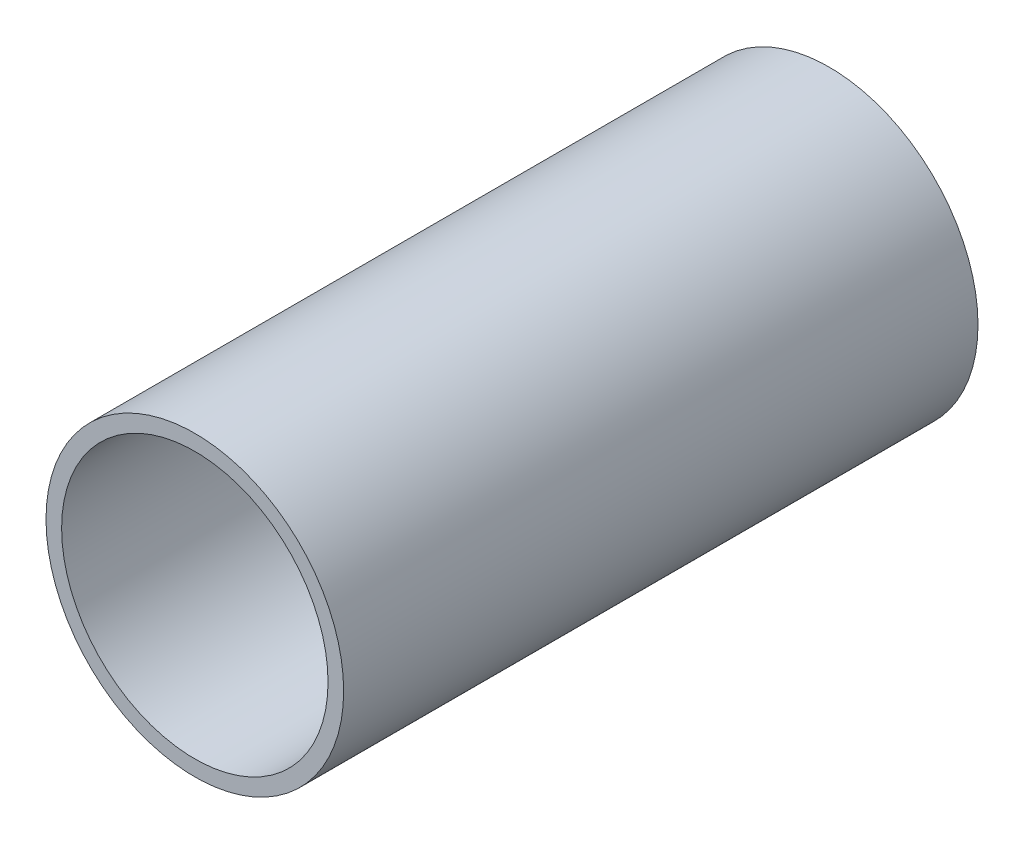
ISO-10303-21;
HEADER;
FILE_DESCRIPTION(('STEP AP214'),'2;1');
FILE_NAME('part.step','',(''),(''),'','','');
FILE_SCHEMA(('AUTOMOTIVE_DESIGN { 1 0 10303 214 1 1 1 1 }'));
ENDSEC;
DATA;
#1=APPLICATION_CONTEXT('core data for automotive mechanical design processes');
#2=APPLICATION_PROTOCOL_DEFINITION('international standard','automotive_design',2000,#1);
#3=PRODUCT_CONTEXT('',#1,'mechanical');
#4=PRODUCT('Part','Part','',(#3));
#5=PRODUCT_RELATED_PRODUCT_CATEGORY('part','',(#4));
#6=PRODUCT_DEFINITION_FORMATION('','',#4);
#7=PRODUCT_DEFINITION_CONTEXT('part definition',#1,'design');
#8=PRODUCT_DEFINITION('design','',#6,#7);
#9=PRODUCT_DEFINITION_SHAPE('','',#8);
#10=(LENGTH_UNIT() NAMED_UNIT(*) SI_UNIT(.MILLI.,.METRE.));
#11=(NAMED_UNIT(*) PLANE_ANGLE_UNIT() SI_UNIT($,.RADIAN.));
#12=(NAMED_UNIT(*) SI_UNIT($,.STERADIAN.) SOLID_ANGLE_UNIT());
#13=UNCERTAINTY_MEASURE_WITH_UNIT(LENGTH_MEASURE(1.E-05),#10,'distance_accuracy_value','');
#14=(GEOMETRIC_REPRESENTATION_CONTEXT(3) GLOBAL_UNCERTAINTY_ASSIGNED_CONTEXT((#13)) GLOBAL_UNIT_ASSIGNED_CONTEXT((#10,
#11,#12)) REPRESENTATION_CONTEXT('',''));
#15=CARTESIAN_POINT('',(0.,0.,0.));
#16=DIRECTION('',(0.,0.,1.));
#17=DIRECTION('',(1.,0.,0.));
#18=AXIS2_PLACEMENT_3D('',#15,#16,#17);
#19=CARTESIAN_POINT('',(0.,0.,65.));
#20=DIRECTION('',(0.,0.,1.));
#21=DIRECTION('',(1.,0.,0.));
#22=AXIS2_PLACEMENT_3D('',#19,#20,#21);
#23=PLANE('',#22);
#24=CARTESIAN_POINT('',(0.,0.,65.));
#25=DIRECTION('',(0.,0.,1.));
#26=DIRECTION('',(1.,0.,0.));
#27=AXIS2_PLACEMENT_3D('',#24,#25,#26);
#28=CIRCLE('',#27,15.25);
#29=CARTESIAN_POINT('',(15.25,0.,65.));
#30=VERTEX_POINT('',#29);
#31=EDGE_CURVE('E10',#30,#30,#28,.T.);
#32=ORIENTED_EDGE('',*,*,#31,.T.);
#33=EDGE_LOOP('',(#32));
#34=FACE_BOUND('',#33,.T.);
#35=CARTESIAN_POINT('',(0.,0.,65.));
#36=DIRECTION('',(0.,0.,1.));
#37=DIRECTION('',(1.,0.,0.));
#38=AXIS2_PLACEMENT_3D('',#35,#36,#37);
#39=CIRCLE('',#38,13.65);
#40=CARTESIAN_POINT('',(13.65,0.,65.));
#41=VERTEX_POINT('',#40);
#42=EDGE_CURVE('E46',#41,#41,#39,.T.);
#43=ORIENTED_EDGE('',*,*,#42,.F.);
#44=EDGE_LOOP('',(#43));
#45=FACE_BOUND('',#44,.T.);
#46=ADVANCED_FACE('F35',(#34,#45),#23,.T.);
#47=CARTESIAN_POINT('',(0.,0.,0.));
#48=DIRECTION('',(0.,0.,1.));
#49=DIRECTION('',(1.,0.,0.));
#50=AXIS2_PLACEMENT_3D('',#47,#48,#49);
#51=PLANE('',#50);
#52=CARTESIAN_POINT('',(0.,0.,0.));
#53=DIRECTION('',(0.,0.,1.));
#54=DIRECTION('',(1.,0.,0.));
#55=AXIS2_PLACEMENT_3D('',#52,#53,#54);
#56=CIRCLE('',#55,15.25);
#57=CARTESIAN_POINT('',(15.25,0.,0.));
#58=VERTEX_POINT('',#57);
#59=EDGE_CURVE('E39',#58,#58,#56,.T.);
#60=ORIENTED_EDGE('',*,*,#59,.F.);
#61=EDGE_LOOP('',(#60));
#62=FACE_BOUND('',#61,.T.);
#63=CARTESIAN_POINT('',(0.,0.,0.));
#64=DIRECTION('',(0.,0.,1.));
#65=DIRECTION('',(1.,0.,0.));
#66=AXIS2_PLACEMENT_3D('',#63,#64,#65);
#67=CIRCLE('',#66,13.65);
#68=CARTESIAN_POINT('',(13.65,0.,0.));
#69=VERTEX_POINT('',#68);
#70=EDGE_CURVE('E48',#69,#69,#67,.T.);
#71=ORIENTED_EDGE('',*,*,#70,.T.);
#72=EDGE_LOOP('',(#71));
#73=FACE_BOUND('',#72,.T.);
#74=ADVANCED_FACE('F58',(#62,#73),#51,.F.);
#75=CARTESIAN_POINT('',(0.,0.,65.));
#76=DIRECTION('',(0.,0.,-1.));
#77=DIRECTION('',(-1.,0.,0.));
#78=AXIS2_PLACEMENT_3D('',#75,#76,#77);
#79=CYLINDRICAL_SURFACE('',#78,15.25);
#80=ORIENTED_EDGE('',*,*,#31,.F.);
#81=EDGE_LOOP('',(#80));
#82=FACE_BOUND('',#81,.T.);
#83=ORIENTED_EDGE('',*,*,#59,.T.);
#84=EDGE_LOOP('',(#83));
#85=FACE_BOUND('',#84,.T.);
#86=ADVANCED_FACE('F37',(#82,#85),#79,.T.);
#87=CARTESIAN_POINT('',(0.,0.,65.));
#88=DIRECTION('',(0.,0.,-1.));
#89=DIRECTION('',(-1.,0.,0.));
#90=AXIS2_PLACEMENT_3D('',#87,#88,#89);
#91=CYLINDRICAL_SURFACE('',#90,13.65);
#92=ORIENTED_EDGE('',*,*,#42,.T.);
#93=EDGE_LOOP('',(#92));
#94=FACE_BOUND('',#93,.T.);
#95=ORIENTED_EDGE('',*,*,#70,.F.);
#96=EDGE_LOOP('',(#95));
#97=FACE_BOUND('',#96,.T.);
#98=ADVANCED_FACE('F54',(#94,#97),#91,.F.);
#99=CLOSED_SHELL('',(#46,#74,#86,#98));
#100=MANIFOLD_SOLID_BREP('B2',#99);
#101=ADVANCED_BREP_SHAPE_REPRESENTATION('',(#18,#100),#14);
#102=SHAPE_DEFINITION_REPRESENTATION(#9,#101);
ENDSEC;
END-ISO-10303-21;
